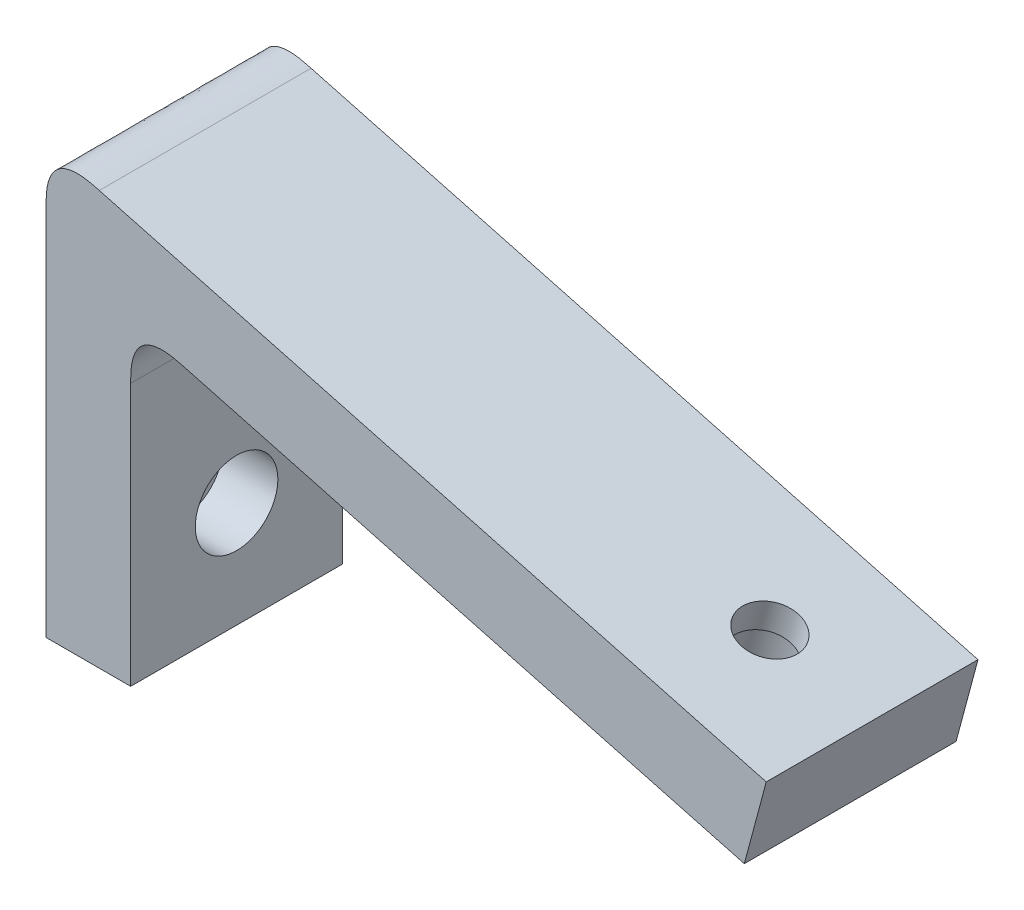
ISO-10303-21;
HEADER;
FILE_DESCRIPTION(('STEP AP214'),'2;1');
FILE_NAME('part.step','',(''),(''),'','','');
FILE_SCHEMA(('AUTOMOTIVE_DESIGN { 1 0 10303 214 1 1 1 1 }'));
ENDSEC;
DATA;
#1=APPLICATION_CONTEXT('core data for automotive mechanical design processes');
#2=APPLICATION_PROTOCOL_DEFINITION('international standard','automotive_design',2000,#1);
#3=PRODUCT_CONTEXT('',#1,'mechanical');
#4=PRODUCT('Part','Part','',(#3));
#5=PRODUCT_RELATED_PRODUCT_CATEGORY('part','',(#4));
#6=PRODUCT_DEFINITION_FORMATION('','',#4);
#7=PRODUCT_DEFINITION_CONTEXT('part definition',#1,'design');
#8=PRODUCT_DEFINITION('design','',#6,#7);
#9=PRODUCT_DEFINITION_SHAPE('','',#8);
#10=(LENGTH_UNIT() NAMED_UNIT(*) SI_UNIT(.MILLI.,.METRE.));
#11=(NAMED_UNIT(*) PLANE_ANGLE_UNIT() SI_UNIT($,.RADIAN.));
#12=(NAMED_UNIT(*) SI_UNIT($,.STERADIAN.) SOLID_ANGLE_UNIT());
#13=UNCERTAINTY_MEASURE_WITH_UNIT(LENGTH_MEASURE(1.E-05),#10,'distance_accuracy_value','');
#14=(GEOMETRIC_REPRESENTATION_CONTEXT(3) GLOBAL_UNCERTAINTY_ASSIGNED_CONTEXT((#13)) GLOBAL_UNIT_ASSIGNED_CONTEXT((#10,
#11,#12)) REPRESENTATION_CONTEXT('',''));
#15=CARTESIAN_POINT('',(0.,0.,0.));
#16=DIRECTION('',(0.,0.,1.));
#17=DIRECTION('',(1.,0.,0.));
#18=AXIS2_PLACEMENT_3D('',#15,#16,#17);
#19=CARTESIAN_POINT('',(0.,12.7,12.7));
#20=DIRECTION('',(-1.,0.,0.));
#21=DIRECTION('',(0.,0.,1.));
#22=AXIS2_PLACEMENT_3D('',#19,#20,#21);
#23=CYLINDRICAL_SURFACE('',#22,3.37819999999999);
#24=CARTESIAN_POINT('',(0.,12.7,12.7));
#25=DIRECTION('',(-1.,0.,0.));
#26=DIRECTION('',(0.,0.,1.));
#27=AXIS2_PLACEMENT_3D('',#24,#25,#26);
#28=CIRCLE('',#27,3.37819999999999);
#29=CARTESIAN_POINT('',(0.,12.7,16.0782));
#30=VERTEX_POINT('',#29);
#31=EDGE_CURVE('E140',#30,#30,#28,.T.);
#32=ORIENTED_EDGE('',*,*,#31,.T.);
#33=EDGE_LOOP('',(#32));
#34=FACE_BOUND('',#33,.T.);
#35=CARTESIAN_POINT('',(3.556,12.7,12.7));
#36=DIRECTION('',(1.,0.,0.));
#37=DIRECTION('',(0.,1.,0.));
#38=AXIS2_PLACEMENT_3D('',#35,#36,#37);
#39=CIRCLE('',#38,3.37819999999999);
#40=CARTESIAN_POINT('',(3.556,16.0782,12.7));
#41=VERTEX_POINT('',#40);
#42=EDGE_CURVE('E49',#41,#41,#39,.F.);
#43=ORIENTED_EDGE('',*,*,#42,.F.);
#44=EDGE_LOOP('',(#43));
#45=FACE_BOUND('',#44,.T.);
#46=ADVANCED_FACE('F41',(#34,#45),#23,.F.);
#47=CARTESIAN_POINT('',(74.1258914675974,31.4787970310866,12.7));
#48=DIRECTION('',(0.258819045102524,0.965925826289067,0.));
#49=DIRECTION('',(-0.965925826289068,0.258819045102524,0.));
#50=AXIS2_PLACEMENT_3D('',#47,#48,#49);
#51=CYLINDRICAL_SURFACE('',#50,3.37819999999999);
#52=CARTESIAN_POINT('',(74.1258914675974,31.4787970310866,12.7));
#53=DIRECTION('',(0.258819045102524,0.965925826289067,0.));
#54=DIRECTION('',(-0.965925826289068,0.258819045102524,0.));
#55=AXIS2_PLACEMENT_3D('',#52,#53,#54);
#56=CIRCLE('',#55,3.37819999999999);
#57=CARTESIAN_POINT('',(70.8628008412277,32.353139529252,12.7));
#58=VERTEX_POINT('',#57);
#59=EDGE_CURVE('E283',#58,#58,#56,.T.);
#60=ORIENTED_EDGE('',*,*,#59,.T.);
#61=EDGE_LOOP('',(#60));
#62=FACE_BOUND('',#61,.T.);
#63=CARTESIAN_POINT('',(73.2055309432129,28.0439647928027,12.7));
#64=DIRECTION('',(-0.258819045102525,-0.965925826289067,0.));
#65=DIRECTION('',(0.965925826289067,-0.258819045102525,0.));
#66=AXIS2_PLACEMENT_3D('',#63,#64,#65);
#67=CIRCLE('',#66,3.37819999999999);
#68=CARTESIAN_POINT('',(76.4686215695826,27.1696222946374,12.7));
#69=VERTEX_POINT('',#68);
#70=EDGE_CURVE('E276',#69,#69,#67,.F.);
#71=ORIENTED_EDGE('',*,*,#70,.F.);
#72=EDGE_LOOP('',(#71));
#73=FACE_BOUND('',#72,.T.);
#74=ADVANCED_FACE('F309',(#62,#73),#51,.F.);
#75=CARTESIAN_POINT('',(10.2055909487752,38.0877839420935,25.4));
#76=DIRECTION('',(-0.258819045102525,-0.965925826289067,0.));
#77=DIRECTION('',(0.965925826289067,-0.258819045102525,0.));
#78=AXIS2_PLACEMENT_3D('',#75,#76,#77);
#79=PLANE('',#78);
#80=CARTESIAN_POINT('',(71.4962899693558,21.6649906359897,12.7));
#81=DIRECTION('',(-0.258819045102525,-0.965925826289067,0.));
#82=DIRECTION('',(0.965925826289067,-0.258819045102525,0.));
#83=AXIS2_PLACEMENT_3D('',#80,#81,#82);
#84=CIRCLE('',#83,4.953);
#85=CARTESIAN_POINT('',(76.2805205869655,20.3830599055969,12.7));
#86=VERTEX_POINT('',#85);
#87=EDGE_CURVE('E289',#86,#86,#84,.T.);
#88=ORIENTED_EDGE('',*,*,#87,.F.);
#89=EDGE_LOOP('',(#88));
#90=FACE_BOUND('',#89,.T.);
#91=DIRECTION('',(-0.965925826289067,0.258819045102525,0.));
#92=VECTOR('',#91,1.);
#93=CARTESIAN_POINT('',(10.2055909487752,38.0877839420935,25.4));
#94=LINE('',#93,#92);
#95=CARTESIAN_POINT('',(83.7635479632269,18.3779887631876,25.4));
#96=VERTEX_POINT('',#95);
#97=CARTESIAN_POINT('',(16.5548007491208,36.3865183035151,25.4));
#98=VERTEX_POINT('',#97);
#99=EDGE_CURVE('E117',#96,#98,#94,.T.);
#100=ORIENTED_EDGE('',*,*,#99,.T.);
#101=CARTESIAN_POINT('',(16.5548007491208,36.3865183035151,-1.27));
#102=CARTESIAN_POINT('',(16.5548007491208,36.3865183035151,8.04333333333333));
#103=CARTESIAN_POINT('',(16.5548007491208,36.3865183035151,17.3566666666566));
#104=CARTESIAN_POINT('',(16.5548007491208,36.3865183035151,26.67));
#105=B_SPLINE_CURVE_WITH_KNOTS('',3,(#101,#102,#103,#104),.UNSPECIFIED.,.F.,.F.,(4,4),(-0.02667,
0.00127),.UNSPECIFIED.);
#106=CARTESIAN_POINT('',(16.5548007491208,36.3865183035151,0.));
#107=VERTEX_POINT('',#106);
#108=EDGE_CURVE('E255',#98,#107,#105,.F.);
#109=ORIENTED_EDGE('',*,*,#108,.T.);
#110=DIRECTION('',(-0.965925826289067,0.258819045102525,0.));
#111=VECTOR('',#110,1.);
#112=CARTESIAN_POINT('',(10.2055909487752,38.0877839420935,0.));
#113=LINE('',#112,#111);
#114=CARTESIAN_POINT('',(83.7635479632269,18.3779887631876,0.));
#115=VERTEX_POINT('',#114);
#116=EDGE_CURVE('E325',#115,#107,#113,.T.);
#117=ORIENTED_EDGE('',*,*,#116,.F.);
#118=DIRECTION('',(0.,0.,-1.));
#119=VECTOR('',#118,1.);
#120=CARTESIAN_POINT('',(83.7635479632269,18.3779887631876,25.4));
#121=LINE('',#120,#119);
#122=EDGE_CURVE('E127',#96,#115,#121,.T.);
#123=ORIENTED_EDGE('',*,*,#122,.F.);
#124=EDGE_LOOP('',(#100,#109,#117,#123));
#125=FACE_BOUND('',#124,.T.);
#126=ADVANCED_FACE('F316',(#90,#125),#79,.T.);
#127=CARTESIAN_POINT('',(0.,0.,25.4));
#128=DIRECTION('',(0.,-1.,0.));
#129=DIRECTION('',(1.,0.,0.));
#130=AXIS2_PLACEMENT_3D('',#127,#128,#129);
#131=PLANE('',#130);
#132=DIRECTION('',(-1.,0.,0.));
#133=VECTOR('',#132,1.);
#134=CARTESIAN_POINT('',(0.,0.,0.));
#135=LINE('',#134,#133);
#136=CARTESIAN_POINT('',(10.16,0.,0.));
#137=VERTEX_POINT('',#136);
#138=CARTESIAN_POINT('',(0.,0.,0.));
#139=VERTEX_POINT('',#138);
#140=EDGE_CURVE('E125',#137,#139,#135,.T.);
#141=ORIENTED_EDGE('',*,*,#140,.F.);
#142=DIRECTION('',(0.,0.,-1.));
#143=VECTOR('',#142,1.);
#144=CARTESIAN_POINT('',(10.16,0.,25.4));
#145=LINE('',#144,#143);
#146=CARTESIAN_POINT('',(10.16,0.,25.4));
#147=VERTEX_POINT('',#146);
#148=EDGE_CURVE('E114',#147,#137,#145,.T.);
#149=ORIENTED_EDGE('',*,*,#148,.F.);
#150=DIRECTION('',(-1.,0.,0.));
#151=VECTOR('',#150,1.);
#152=CARTESIAN_POINT('',(0.,0.,25.4));
#153=LINE('',#152,#151);
#154=CARTESIAN_POINT('',(0.,0.,25.4));
#155=VERTEX_POINT('',#154);
#156=EDGE_CURVE('E118',#147,#155,#153,.T.);
#157=ORIENTED_EDGE('',*,*,#156,.T.);
#158=DIRECTION('',(0.,0.,-1.));
#159=VECTOR('',#158,1.);
#160=CARTESIAN_POINT('',(0.,0.,25.4));
#161=LINE('',#160,#159);
#162=EDGE_CURVE('E363',#155,#139,#161,.T.);
#163=ORIENTED_EDGE('',*,*,#162,.T.);
#164=EDGE_LOOP('',(#141,#149,#157,#163));
#165=FACE_BOUND('',#164,.T.);
#166=ADVANCED_FACE('F122',(#165),#131,.T.);
#167=CARTESIAN_POINT('',(10.16,0.,25.4));
#168=DIRECTION('',(1.,0.,0.));
#169=DIRECTION('',(0.,1.,0.));
#170=AXIS2_PLACEMENT_3D('',#167,#168,#169);
#171=PLANE('',#170);
#172=CARTESIAN_POINT('',(10.16,12.7,12.7));
#173=DIRECTION('',(1.,0.,0.));
#174=DIRECTION('',(0.,1.,0.));
#175=AXIS2_PLACEMENT_3D('',#172,#173,#174);
#176=CIRCLE('',#175,4.953);
#177=CARTESIAN_POINT('',(10.16,17.653,12.7));
#178=VERTEX_POINT('',#177);
#179=EDGE_CURVE('E296',#178,#178,#176,.T.);
#180=ORIENTED_EDGE('',*,*,#179,.F.);
#181=EDGE_LOOP('',(#180));
#182=FACE_BOUND('',#181,.T.);
#183=DIRECTION('',(0.,-1.,0.));
#184=VECTOR('',#183,1.);
#185=CARTESIAN_POINT('',(10.16,0.,0.));
#186=LINE('',#185,#184);
#187=CARTESIAN_POINT('',(10.16,31.4796151059667,0.));
#188=VERTEX_POINT('',#187);
#189=EDGE_CURVE('E321',#188,#137,#186,.T.);
#190=ORIENTED_EDGE('',*,*,#189,.F.);
#191=CARTESIAN_POINT('',(10.16,31.4796151059667,26.67));
#192=CARTESIAN_POINT('',(10.16,31.4796151059667,17.3566666666566));
#193=CARTESIAN_POINT('',(10.16,31.4796151059667,8.04333333333333));
#194=CARTESIAN_POINT('',(10.16,31.4796151059667,-1.27));
#195=B_SPLINE_CURVE_WITH_KNOTS('',3,(#191,#192,#193,#194),.UNSPECIFIED.,.F.,.F.,(4,4),(-0.02667,
0.00127),.UNSPECIFIED.);
#196=CARTESIAN_POINT('',(10.16,31.4796151059667,25.4));
#197=VERTEX_POINT('',#196);
#198=EDGE_CURVE('E68',#188,#197,#195,.F.);
#199=ORIENTED_EDGE('',*,*,#198,.T.);
#200=DIRECTION('',(0.,-1.,0.));
#201=VECTOR('',#200,1.);
#202=CARTESIAN_POINT('',(10.16,0.,25.4));
#203=LINE('',#202,#201);
#204=EDGE_CURVE('E111',#197,#147,#203,.T.);
#205=ORIENTED_EDGE('',*,*,#204,.T.);
#206=ORIENTED_EDGE('',*,*,#148,.T.);
#207=EDGE_LOOP('',(#190,#199,#205,#206));
#208=FACE_BOUND('',#207,.T.);
#209=ADVANCED_FACE('F113',(#182,#208),#171,.T.);
#210=CARTESIAN_POINT('',(73.5579570144518,-19.7097951789058,25.4));
#211=DIRECTION('',(0.965925826289068,-0.258819045102523,0.));
#212=DIRECTION('',(0.258819045102523,0.965925826289068,0.));
#213=AXIS2_PLACEMENT_3D('',#210,#211,#212);
#214=PLANE('',#213);
#215=DIRECTION('',(-0.258819045102523,-0.965925826289068,0.));
#216=VECTOR('',#215,1.);
#217=CARTESIAN_POINT('',(73.5579570144518,-19.7097951789058,0.));
#218=LINE('',#217,#216);
#219=CARTESIAN_POINT('',(86.3931494614686,28.1917951582846,0.));
#220=VERTEX_POINT('',#219);
#221=EDGE_CURVE('E419',#220,#115,#218,.T.);
#222=ORIENTED_EDGE('',*,*,#221,.F.);
#223=DIRECTION('',(0.,0.,-1.));
#224=VECTOR('',#223,1.);
#225=CARTESIAN_POINT('',(86.3931494614686,28.1917951582846,25.4));
#226=LINE('',#225,#224);
#227=CARTESIAN_POINT('',(86.3931494614686,28.1917951582846,25.4));
#228=VERTEX_POINT('',#227);
#229=EDGE_CURVE('E358',#228,#220,#226,.T.);
#230=ORIENTED_EDGE('',*,*,#229,.F.);
#231=DIRECTION('',(-0.258819045102523,-0.965925826289068,0.));
#232=VECTOR('',#231,1.);
#233=CARTESIAN_POINT('',(73.5579570144518,-19.7097951789058,25.4));
#234=LINE('',#233,#232);
#235=EDGE_CURVE('E153',#228,#96,#234,.T.);
#236=ORIENTED_EDGE('',*,*,#235,.T.);
#237=ORIENTED_EDGE('',*,*,#122,.T.);
#238=EDGE_LOOP('',(#222,#230,#236,#237));
#239=FACE_BOUND('',#238,.T.);
#240=ADVANCED_FACE('F355',(#239),#214,.T.);
#241=CARTESIAN_POINT('',(12.8351924470168,47.9015903371904,25.4));
#242=DIRECTION('',(0.258819045102524,0.965925826289067,0.));
#243=DIRECTION('',(-0.965925826289067,0.258819045102524,0.));
#244=AXIS2_PLACEMENT_3D('',#241,#242,#243);
#245=PLANE('',#244);
#246=ORIENTED_EDGE('',*,*,#59,.F.);
#247=EDGE_LOOP('',(#246));
#248=FACE_BOUND('',#247,.T.);
#249=DIRECTION('',(0.965925826289067,-0.258819045102524,0.));
#250=VECTOR('',#249,1.);
#251=CARTESIAN_POINT('',(12.8351924470168,47.9015903371904,0.));
#252=LINE('',#251,#250);
#253=CARTESIAN_POINT('',(6.39480074912082,49.6272880915818,0.));
#254=VERTEX_POINT('',#253);
#255=EDGE_CURVE('E136',#254,#220,#252,.T.);
#256=ORIENTED_EDGE('',*,*,#255,.F.);
#257=CARTESIAN_POINT('',(6.39480074912082,49.6272880915818,26.67));
#258=CARTESIAN_POINT('',(6.39480074912082,49.6272880915818,17.3566666666404));
#259=CARTESIAN_POINT('',(6.39480074912082,49.6272880915818,8.04333333333333));
#260=CARTESIAN_POINT('',(6.39480074912082,49.6272880915818,-1.27));
#261=B_SPLINE_CURVE_WITH_KNOTS('',3,(#257,#258,#259,#260),.UNSPECIFIED.,.F.,.F.,(4,4),(-0.00127,
0.02667),.UNSPECIFIED.);
#262=CARTESIAN_POINT('',(6.39480074912082,49.6272880915818,25.4));
#263=VERTEX_POINT('',#262);
#264=EDGE_CURVE('E234',#254,#263,#261,.F.);
#265=ORIENTED_EDGE('',*,*,#264,.T.);
#266=DIRECTION('',(0.965925826289067,-0.258819045102524,0.));
#267=VECTOR('',#266,1.);
#268=CARTESIAN_POINT('',(12.8351924470168,47.9015903371904,25.4));
#269=LINE('',#268,#267);
#270=EDGE_CURVE('E343',#263,#228,#269,.T.);
#271=ORIENTED_EDGE('',*,*,#270,.T.);
#272=ORIENTED_EDGE('',*,*,#229,.T.);
#273=EDGE_LOOP('',(#256,#265,#271,#272));
#274=FACE_BOUND('',#273,.T.);
#275=ADVANCED_FACE('F405',(#248,#274),#245,.T.);
#276=CARTESIAN_POINT('',(0.,0.,25.4));
#277=DIRECTION('',(-1.,0.,0.));
#278=DIRECTION('',(0.,-1.,0.));
#279=AXIS2_PLACEMENT_3D('',#276,#277,#278);
#280=PLANE('',#279);
#281=ORIENTED_EDGE('',*,*,#31,.F.);
#282=EDGE_LOOP('',(#281));
#283=FACE_BOUND('',#282,.T.);
#284=DIRECTION('',(0.,1.,0.));
#285=VECTOR('',#284,1.);
#286=CARTESIAN_POINT('',(0.,0.,25.4));
#287=LINE('',#286,#285);
#288=CARTESIAN_POINT('',(0.,44.7203848940333,25.4));
#289=VERTEX_POINT('',#288);
#290=EDGE_CURVE('E132',#155,#289,#287,.T.);
#291=ORIENTED_EDGE('',*,*,#290,.T.);
#292=CARTESIAN_POINT('',(0.,44.7203848940333,-1.27));
#293=CARTESIAN_POINT('',(0.,44.7203848940333,8.04333333333333));
#294=CARTESIAN_POINT('',(0.,44.7203848940333,17.3566666666404));
#295=CARTESIAN_POINT('',(0.,44.7203848940333,26.67));
#296=B_SPLINE_CURVE_WITH_KNOTS('',3,(#292,#293,#294,#295),.UNSPECIFIED.,.F.,.F.,(4,4),(-0.00127,
0.02667),.UNSPECIFIED.);
#297=CARTESIAN_POINT('',(0.,44.7203848940333,0.));
#298=VERTEX_POINT('',#297);
#299=EDGE_CURVE('E126',#289,#298,#296,.F.);
#300=ORIENTED_EDGE('',*,*,#299,.T.);
#301=DIRECTION('',(0.,1.,0.));
#302=VECTOR('',#301,1.);
#303=CARTESIAN_POINT('',(0.,0.,0.));
#304=LINE('',#303,#302);
#305=EDGE_CURVE('E133',#139,#298,#304,.T.);
#306=ORIENTED_EDGE('',*,*,#305,.F.);
#307=ORIENTED_EDGE('',*,*,#162,.F.);
#308=EDGE_LOOP('',(#291,#300,#306,#307));
#309=FACE_BOUND('',#308,.T.);
#310=ADVANCED_FACE('F173',(#283,#309),#280,.T.);
#311=CARTESIAN_POINT('',(0.,0.,25.4));
#312=DIRECTION('',(0.,0.,1.));
#313=DIRECTION('',(1.,0.,0.));
#314=AXIS2_PLACEMENT_3D('',#311,#312,#313);
#315=PLANE('',#314);
#316=ORIENTED_EDGE('',*,*,#270,.F.);
#317=CARTESIAN_POINT('',(0.,44.7203848940333,25.4));
#318=CARTESIAN_POINT('',(0.,45.7805789830396,25.4));
#319=CARTESIAN_POINT('',(0.,46.8407730720459,25.4));
#320=CARTESIAN_POINT('',(0.538604258562221,49.1388481470478,25.4));
#321=CARTESIAN_POINT('',(1.98749194063571,50.2506187680531,25.4));
#322=CARTESIAN_POINT('',(4.34666304622046,50.1760849350617,25.4));
#323=CARTESIAN_POINT('',(5.37073189767064,49.9016865133217,25.4));
#324=CARTESIAN_POINT('',(6.39480074912082,49.6272880915818,25.4));
#325=B_SPLINE_CURVE_WITH_KNOTS('',5,(#317,#318,#319,#320,#321,#322,#323,#324),.UNSPECIFIED.,.F.,
.F.,(6,2,6),(0.,0.5,1.),.UNSPECIFIED.);
#326=EDGE_CURVE('E156',#263,#289,#325,.F.);
#327=ORIENTED_EDGE('',*,*,#326,.T.);
#328=ORIENTED_EDGE('',*,*,#290,.F.);
#329=ORIENTED_EDGE('',*,*,#156,.F.);
#330=ORIENTED_EDGE('',*,*,#204,.F.);
#331=CARTESIAN_POINT('',(16.5548007491208,36.3865183035151,25.4));
#332=CARTESIAN_POINT('',(15.5307318976706,36.6609167252551,25.4));
#333=CARTESIAN_POINT('',(14.5066630462205,36.935315146995,25.4));
#334=CARTESIAN_POINT('',(12.1474919406357,37.0098489799864,25.4));
#335=CARTESIAN_POINT('',(10.6986042585622,35.8980783589811,25.4));
#336=CARTESIAN_POINT('',(10.16,33.6000032839792,25.4));
#337=CARTESIAN_POINT('',(10.16,32.5398091949729,25.4));
#338=CARTESIAN_POINT('',(10.16,31.4796151059667,25.4));
#339=B_SPLINE_CURVE_WITH_KNOTS('',5,(#331,#332,#333,#334,#335,#336,#337,#338),.UNSPECIFIED.,.F.,
.F.,(6,2,6),(0.,0.5,1.),.UNSPECIFIED.);
#340=EDGE_CURVE('E11',#197,#98,#339,.F.);
#341=ORIENTED_EDGE('',*,*,#340,.T.);
#342=ORIENTED_EDGE('',*,*,#99,.F.);
#343=ORIENTED_EDGE('',*,*,#235,.F.);
#344=EDGE_LOOP('',(#316,#327,#328,#329,#330,#341,#342,#343));
#345=FACE_BOUND('',#344,.T.);
#346=ADVANCED_FACE('F130',(#345),#315,.T.);
#347=CARTESIAN_POINT('',(0.,0.,0.));
#348=DIRECTION('',(0.,0.,1.));
#349=DIRECTION('',(1.,0.,0.));
#350=AXIS2_PLACEMENT_3D('',#347,#348,#349);
#351=PLANE('',#350);
#352=ORIENTED_EDGE('',*,*,#305,.T.);
#353=CARTESIAN_POINT('',(6.39480074912082,49.6272880915818,0.));
#354=CARTESIAN_POINT('',(5.37073189767064,49.9016865133217,0.));
#355=CARTESIAN_POINT('',(4.34666304622046,50.1760849350617,0.));
#356=CARTESIAN_POINT('',(1.98749194063571,50.2506187680531,0.));
#357=CARTESIAN_POINT('',(0.538604258562221,49.1388481470478,0.));
#358=CARTESIAN_POINT('',(0.,46.8407730720459,0.));
#359=CARTESIAN_POINT('',(0.,45.7805789830396,0.));
#360=CARTESIAN_POINT('',(0.,44.7203848940333,0.));
#361=B_SPLINE_CURVE_WITH_KNOTS('',5,(#353,#354,#355,#356,#357,#358,#359,#360),.UNSPECIFIED.,.F.,
.F.,(6,2,6),(0.,0.5,1.),.UNSPECIFIED.);
#362=EDGE_CURVE('E192',#298,#254,#361,.F.);
#363=ORIENTED_EDGE('',*,*,#362,.T.);
#364=ORIENTED_EDGE('',*,*,#255,.T.);
#365=ORIENTED_EDGE('',*,*,#221,.T.);
#366=ORIENTED_EDGE('',*,*,#116,.T.);
#367=CARTESIAN_POINT('',(10.16,31.4796151059667,0.));
#368=CARTESIAN_POINT('',(10.16,32.5398091949729,0.));
#369=CARTESIAN_POINT('',(10.16,33.6000032839792,0.));
#370=CARTESIAN_POINT('',(10.6986042585622,35.8980783589811,0.));
#371=CARTESIAN_POINT('',(12.1474919406357,37.0098489799864,0.));
#372=CARTESIAN_POINT('',(14.5066630462205,36.935315146995,0.));
#373=CARTESIAN_POINT('',(15.5307318976706,36.660916725255,0.));
#374=CARTESIAN_POINT('',(16.5548007491208,36.3865183035151,0.));
#375=B_SPLINE_CURVE_WITH_KNOTS('',5,(#367,#368,#369,#370,#371,#372,#373,#374),.UNSPECIFIED.,.F.,
.F.,(6,2,6),(0.,0.5,1.),.UNSPECIFIED.);
#376=EDGE_CURVE('E54',#107,#188,#375,.F.);
#377=ORIENTED_EDGE('',*,*,#376,.T.);
#378=ORIENTED_EDGE('',*,*,#189,.T.);
#379=ORIENTED_EDGE('',*,*,#140,.T.);
#380=EDGE_LOOP('',(#352,#363,#364,#365,#366,#377,#378,#379));
#381=FACE_BOUND('',#380,.T.);
#382=ADVANCED_FACE('F172',(#381),#351,.F.);
#383=CARTESIAN_POINT('',(0.,44.7203848940333,26.67));
#384=CARTESIAN_POINT('',(0.,44.7203848940333,17.3566666666404));
#385=CARTESIAN_POINT('',(0.,44.7203848940333,8.04333333333333));
#386=CARTESIAN_POINT('',(0.,44.7203848940333,-1.27));
#387=CARTESIAN_POINT('',(0.,45.7805789830396,26.67));
#388=CARTESIAN_POINT('',(0.,45.7805789830396,17.3566666666404));
#389=CARTESIAN_POINT('',(0.,45.7805789830396,8.04333333333333));
#390=CARTESIAN_POINT('',(0.,45.7805789830396,-1.27));
#391=CARTESIAN_POINT('',(0.,46.8407730720459,26.67));
#392=CARTESIAN_POINT('',(0.,46.8407730720459,17.3566666666404));
#393=CARTESIAN_POINT('',(0.,46.8407730720459,8.04333333333333));
#394=CARTESIAN_POINT('',(0.,46.8407730720459,-1.27));
#395=CARTESIAN_POINT('',(0.538604258562221,49.1388481470478,26.67));
#396=CARTESIAN_POINT('',(0.538604258562221,49.1388481470478,17.3566666666404));
#397=CARTESIAN_POINT('',(0.538604258562221,49.1388481470478,8.04333333333333));
#398=CARTESIAN_POINT('',(0.538604258562221,49.1388481470478,-1.27));
#399=CARTESIAN_POINT('',(1.98749194063571,50.2506187680531,26.67));
#400=CARTESIAN_POINT('',(1.98749194063571,50.2506187680531,17.3566666666404));
#401=CARTESIAN_POINT('',(1.98749194063571,50.2506187680531,8.04333333333333));
#402=CARTESIAN_POINT('',(1.98749194063571,50.2506187680531,-1.27));
#403=CARTESIAN_POINT('',(4.34666304622046,50.1760849350617,26.67));
#404=CARTESIAN_POINT('',(4.34666304622046,50.1760849350617,17.3566666666404));
#405=CARTESIAN_POINT('',(4.34666304622046,50.1760849350617,8.04333333333333));
#406=CARTESIAN_POINT('',(4.34666304622046,50.1760849350617,-1.27));
#407=CARTESIAN_POINT('',(5.37073189767064,49.9016865133217,26.67));
#408=CARTESIAN_POINT('',(5.37073189767064,49.9016865133217,17.3566666666404));
#409=CARTESIAN_POINT('',(5.37073189767064,49.9016865133217,8.04333333333333));
#410=CARTESIAN_POINT('',(5.37073189767064,49.9016865133217,-1.27));
#411=CARTESIAN_POINT('',(6.39480074912082,49.6272880915818,26.67));
#412=CARTESIAN_POINT('',(6.39480074912082,49.6272880915818,17.3566666666404));
#413=CARTESIAN_POINT('',(6.39480074912082,49.6272880915818,8.04333333333333));
#414=CARTESIAN_POINT('',(6.39480074912082,49.6272880915818,-1.27));
#415=B_SPLINE_SURFACE_WITH_KNOTS('',5,3,((#383,#384,#385,#386),(#387,#388,#389,#390),(#391,#392,
#393,#394),(#395,#396,#397,#398),(#399,#400,#401,#402),(#403,#404,#405,#406),(#407,#408,#409,
#410),(#411,#412,#413,#414)),.UNSPECIFIED.,.F.,.F.,.F.,(6,2,6),(4,4),(0.,0.5,1.),(-0.00127,
0.02667),.UNSPECIFIED.);
#416=ORIENTED_EDGE('',*,*,#326,.F.);
#417=ORIENTED_EDGE('',*,*,#264,.F.);
#418=ORIENTED_EDGE('',*,*,#362,.F.);
#419=ORIENTED_EDGE('',*,*,#299,.F.);
#420=EDGE_LOOP('',(#416,#417,#418,#419));
#421=FACE_BOUND('',#420,.T.);
#422=ADVANCED_FACE('F199',(#421),#415,.T.);
#423=CARTESIAN_POINT('',(10.16,31.4796151059667,-1.27));
#424=CARTESIAN_POINT('',(10.16,31.4796151059667,8.04333333333333));
#425=CARTESIAN_POINT('',(10.16,31.4796151059667,17.3566666666566));
#426=CARTESIAN_POINT('',(10.16,31.4796151059667,26.67));
#427=CARTESIAN_POINT('',(10.16,32.5398091949729,-1.27));
#428=CARTESIAN_POINT('',(10.16,32.5398091949729,8.04333333333333));
#429=CARTESIAN_POINT('',(10.16,32.5398091949729,17.3566666666566));
#430=CARTESIAN_POINT('',(10.16,32.5398091949729,26.67));
#431=CARTESIAN_POINT('',(10.16,33.6000032839792,-1.27));
#432=CARTESIAN_POINT('',(10.16,33.6000032839792,8.04333333333333));
#433=CARTESIAN_POINT('',(10.16,33.6000032839792,17.3566666666566));
#434=CARTESIAN_POINT('',(10.16,33.6000032839792,26.67));
#435=CARTESIAN_POINT('',(10.6986042585622,35.8980783589811,-1.27));
#436=CARTESIAN_POINT('',(10.6986042585622,35.8980783589811,8.04333333333333));
#437=CARTESIAN_POINT('',(10.6986042585622,35.8980783589811,17.3566666666566));
#438=CARTESIAN_POINT('',(10.6986042585622,35.8980783589811,26.67));
#439=CARTESIAN_POINT('',(12.1474919406357,37.0098489799864,-1.27));
#440=CARTESIAN_POINT('',(12.1474919406357,37.0098489799864,8.04333333333333));
#441=CARTESIAN_POINT('',(12.1474919406357,37.0098489799864,17.3566666666566));
#442=CARTESIAN_POINT('',(12.1474919406357,37.0098489799864,26.67));
#443=CARTESIAN_POINT('',(14.5066630462205,36.935315146995,-1.27));
#444=CARTESIAN_POINT('',(14.5066630462205,36.935315146995,8.04333333333333));
#445=CARTESIAN_POINT('',(14.5066630462205,36.935315146995,17.3566666666566));
#446=CARTESIAN_POINT('',(14.5066630462205,36.935315146995,26.67));
#447=CARTESIAN_POINT('',(15.5307318976706,36.6609167252551,-1.27));
#448=CARTESIAN_POINT('',(15.5307318976706,36.6609167252551,8.04333333333333));
#449=CARTESIAN_POINT('',(15.5307318976706,36.6609167252551,17.3566666666566));
#450=CARTESIAN_POINT('',(15.5307318976706,36.6609167252551,26.67));
#451=CARTESIAN_POINT('',(16.5548007491208,36.3865183035151,-1.27));
#452=CARTESIAN_POINT('',(16.5548007491208,36.3865183035151,8.04333333333333));
#453=CARTESIAN_POINT('',(16.5548007491208,36.3865183035151,17.3566666666566));
#454=CARTESIAN_POINT('',(16.5548007491208,36.3865183035151,26.67));
#455=B_SPLINE_SURFACE_WITH_KNOTS('',5,3,((#423,#424,#425,#426),(#427,#428,#429,#430),(#431,#432,
#433,#434),(#435,#436,#437,#438),(#439,#440,#441,#442),(#443,#444,#445,#446),(#447,#448,#449,
#450),(#451,#452,#453,#454)),.UNSPECIFIED.,.F.,.F.,.F.,(6,2,6),(4,4),(0.,0.5,1.),(-0.02667,
0.00127),.UNSPECIFIED.);
#456=ORIENTED_EDGE('',*,*,#340,.F.);
#457=ORIENTED_EDGE('',*,*,#198,.F.);
#458=ORIENTED_EDGE('',*,*,#376,.F.);
#459=ORIENTED_EDGE('',*,*,#108,.F.);
#460=EDGE_LOOP('',(#456,#457,#458,#459));
#461=FACE_BOUND('',#460,.T.);
#462=ADVANCED_FACE('F44',(#461),#455,.T.);
#463=CARTESIAN_POINT('',(73.2055309432129,28.0439647928027,12.7));
#464=DIRECTION('',(-0.258819045102525,-0.965925826289067,0.));
#465=DIRECTION('',(0.965925826289067,-0.258819045102525,0.));
#466=AXIS2_PLACEMENT_3D('',#463,#464,#465);
#467=PLANE('',#466);
#468=CARTESIAN_POINT('',(73.2055309432129,28.0439647928027,12.7));
#469=DIRECTION('',(-0.258819045102525,-0.965925826289067,0.));
#470=DIRECTION('',(0.965925826289067,-0.258819045102525,0.));
#471=AXIS2_PLACEMENT_3D('',#468,#469,#470);
#472=CIRCLE('',#471,4.953);
#473=CARTESIAN_POINT('',(77.9897615608226,26.7620340624099,12.7));
#474=VERTEX_POINT('',#473);
#475=EDGE_CURVE('E284',#474,#474,#472,.T.);
#476=ORIENTED_EDGE('',*,*,#475,.T.);
#477=EDGE_LOOP('',(#476));
#478=FACE_BOUND('',#477,.T.);
#479=ORIENTED_EDGE('',*,*,#70,.T.);
#480=EDGE_LOOP('',(#479));
#481=FACE_BOUND('',#480,.T.);
#482=ADVANCED_FACE('F447',(#478,#481),#467,.T.);
#483=CARTESIAN_POINT('',(73.2055309432129,28.0439647928027,12.7));
#484=DIRECTION('',(-0.258819045102525,-0.965925826289067,0.));
#485=DIRECTION('',(0.965925826289067,-0.258819045102525,0.));
#486=AXIS2_PLACEMENT_3D('',#483,#484,#485);
#487=CYLINDRICAL_SURFACE('',#486,4.953);
#488=ORIENTED_EDGE('',*,*,#475,.F.);
#489=EDGE_LOOP('',(#488));
#490=FACE_BOUND('',#489,.T.);
#491=ORIENTED_EDGE('',*,*,#87,.T.);
#492=EDGE_LOOP('',(#491));
#493=FACE_BOUND('',#492,.T.);
#494=ADVANCED_FACE('F462',(#490,#493),#487,.F.);
#495=CARTESIAN_POINT('',(3.556,12.7,12.7));
#496=DIRECTION('',(1.,0.,0.));
#497=DIRECTION('',(0.,1.,0.));
#498=AXIS2_PLACEMENT_3D('',#495,#496,#497);
#499=PLANE('',#498);
#500=CARTESIAN_POINT('',(3.556,12.7,12.7));
#501=DIRECTION('',(1.,0.,0.));
#502=DIRECTION('',(0.,1.,0.));
#503=AXIS2_PLACEMENT_3D('',#500,#501,#502);
#504=CIRCLE('',#503,4.953);
#505=CARTESIAN_POINT('',(3.556,17.653,12.7));
#506=VERTEX_POINT('',#505);
#507=EDGE_CURVE('E299',#506,#506,#504,.T.);
#508=ORIENTED_EDGE('',*,*,#507,.T.);
#509=EDGE_LOOP('',(#508));
#510=FACE_BOUND('',#509,.T.);
#511=ORIENTED_EDGE('',*,*,#42,.T.);
#512=EDGE_LOOP('',(#511));
#513=FACE_BOUND('',#512,.T.);
#514=ADVANCED_FACE('F306',(#510,#513),#499,.T.);
#515=CARTESIAN_POINT('',(3.556,12.7,12.7));
#516=DIRECTION('',(1.,0.,0.));
#517=DIRECTION('',(0.,1.,0.));
#518=AXIS2_PLACEMENT_3D('',#515,#516,#517);
#519=CYLINDRICAL_SURFACE('',#518,4.953);
#520=CARTESIAN_POINT('',(3.556,17.653,12.7));
#521=CARTESIAN_POINT('',(3.62479166666667,17.653,12.7));
#522=CARTESIAN_POINT('',(3.69358333333333,17.653,12.7));
#523=CARTESIAN_POINT('',(3.83116666666667,17.653,12.7));
#524=CARTESIAN_POINT('',(3.89995833333333,17.653,12.7));
#525=CARTESIAN_POINT('',(4.03754166666667,17.653,12.7));
#526=CARTESIAN_POINT('',(4.10633333333333,17.653,12.7));
#527=CARTESIAN_POINT('',(4.24391666666666,17.653,12.7));
#528=CARTESIAN_POINT('',(4.31270833333333,17.653,12.7));
#529=CARTESIAN_POINT('',(4.45029166666666,17.653,12.7));
#530=CARTESIAN_POINT('',(4.51908333333333,17.653,12.7));
#531=CARTESIAN_POINT('',(4.65666666666666,17.653,12.7));
#532=CARTESIAN_POINT('',(4.72545833333333,17.653,12.7));
#533=CARTESIAN_POINT('',(4.86304166666666,17.653,12.7));
#534=CARTESIAN_POINT('',(4.93183333333333,17.653,12.7));
#535=CARTESIAN_POINT('',(5.06941666666666,17.653,12.7));
#536=CARTESIAN_POINT('',(5.13820833333333,17.653,12.7));
#537=CARTESIAN_POINT('',(5.27579166666666,17.653,12.7));
#538=CARTESIAN_POINT('',(5.34458333333333,17.653,12.7));
#539=CARTESIAN_POINT('',(5.48216666666666,17.653,12.7));
#540=CARTESIAN_POINT('',(5.55095833333333,17.653,12.7));
#541=CARTESIAN_POINT('',(5.68854166666666,17.653,12.7));
#542=CARTESIAN_POINT('',(5.75733333333333,17.653,12.7));
#543=CARTESIAN_POINT('',(5.89491666666666,17.653,12.7));
#544=CARTESIAN_POINT('',(5.96370833333333,17.653,12.7));
#545=CARTESIAN_POINT('',(6.10129166666666,17.653,12.7));
#546=CARTESIAN_POINT('',(6.17008333333333,17.653,12.7));
#547=CARTESIAN_POINT('',(6.30766666666666,17.653,12.7));
#548=CARTESIAN_POINT('',(6.37645833333333,17.653,12.7));
#549=CARTESIAN_POINT('',(6.51404166666666,17.653,12.7));
#550=CARTESIAN_POINT('',(6.58283333333333,17.653,12.7));
#551=CARTESIAN_POINT('',(6.72041666666666,17.653,12.7));
#552=CARTESIAN_POINT('',(6.78920833333333,17.653,12.7));
#553=CARTESIAN_POINT('',(6.92679166666666,17.653,12.7));
#554=CARTESIAN_POINT('',(6.99558333333333,17.653,12.7));
#555=CARTESIAN_POINT('',(7.13316666666666,17.653,12.7));
#556=CARTESIAN_POINT('',(7.20195833333333,17.653,12.7));
#557=CARTESIAN_POINT('',(7.33954166666666,17.653,12.7));
#558=CARTESIAN_POINT('',(7.40833333333333,17.653,12.7));
#559=CARTESIAN_POINT('',(7.54591666666666,17.653,12.7));
#560=CARTESIAN_POINT('',(7.61470833333333,17.653,12.7));
#561=CARTESIAN_POINT('',(7.75229166666666,17.653,12.7));
#562=CARTESIAN_POINT('',(7.82108333333333,17.653,12.7));
#563=CARTESIAN_POINT('',(7.95866666666666,17.653,12.7));
#564=CARTESIAN_POINT('',(8.02745833333333,17.653,12.7));
#565=CARTESIAN_POINT('',(8.16504166666666,17.653,12.7));
#566=CARTESIAN_POINT('',(8.23383333333333,17.653,12.7));
#567=CARTESIAN_POINT('',(8.37141666666666,17.653,12.7));
#568=CARTESIAN_POINT('',(8.44020833333333,17.653,12.7));
#569=CARTESIAN_POINT('',(8.57779166666667,17.653,12.7));
#570=CARTESIAN_POINT('',(8.64658333333333,17.653,12.7));
#571=CARTESIAN_POINT('',(8.78416666666666,17.653,12.7));
#572=CARTESIAN_POINT('',(8.85295833333333,17.653,12.7));
#573=CARTESIAN_POINT('',(8.99054166666667,17.653,12.7));
#574=CARTESIAN_POINT('',(9.05933333333333,17.653,12.7));
#575=CARTESIAN_POINT('',(9.19691666666666,17.653,12.7));
#576=CARTESIAN_POINT('',(9.26570833333333,17.653,12.7));
#577=CARTESIAN_POINT('',(9.40329166666667,17.653,12.7));
#578=CARTESIAN_POINT('',(9.47208333333333,17.653,12.7));
#579=CARTESIAN_POINT('',(9.60966666666666,17.653,12.7));
#580=CARTESIAN_POINT('',(9.67845833333333,17.653,12.7));
#581=CARTESIAN_POINT('',(9.81604166666667,17.653,12.7));
#582=CARTESIAN_POINT('',(9.88483333333333,17.653,12.7));
#583=CARTESIAN_POINT('',(10.0224166666667,17.653,12.7));
#584=CARTESIAN_POINT('',(10.0912083333333,17.653,12.7));
#585=CARTESIAN_POINT('',(10.16,17.653,12.7));
#586=B_SPLINE_CURVE_WITH_KNOTS('',3,(#520,#521,#522,#523,#524,#525,#526,#527,#528,#529,#530,
#531,#532,#533,#534,#535,#536,#537,#538,#539,#540,#541,#542,#543,#544,#545,#546,#547,#548,#549,
#550,#551,#552,#553,#554,#555,#556,#557,#558,#559,#560,#561,#562,#563,#564,#565,#566,#567,#568,
#569,#570,#571,#572,#573,#574,#575,#576,#577,#578,#579,#580,#581,#582,#583,#584,#585),
.UNSPECIFIED.,.F.,.F.,(4,2,2,2,2,2,2,2,2,2,2,2,2,2,2,2,2,2,2,2,2,2,2,2,2,2,2,2,2,2,2,2,4),(0.,
0.206375,0.41275,0.619125,0.8255,1.031875,1.23825,1.444625,1.651,1.857375,2.06375,2.270125,
2.4765,2.682875,2.88925,3.095625,3.302,3.508375,3.71475,3.921125,4.1275,4.333875,4.54025,
4.746625,4.953,5.159375,5.36575,5.572125,5.7785,5.984875,6.19125,6.397625,6.604),.UNSPECIFIED.);
#587=EDGE_CURVE('BSEAM484',#506,#178,#586,.T.);
#588=ORIENTED_EDGE('',*,*,#507,.F.);
#589=ORIENTED_EDGE('',*,*,#179,.T.);
#590=ORIENTED_EDGE('',*,*,#587,.T.);
#591=ORIENTED_EDGE('',*,*,#587,.F.);
#592=EDGE_LOOP('',(#588,#590,#589,#591));
#593=FACE_BOUND('',#592,.T.);
#594=ADVANCED_FACE('F484',(#593),#519,.F.);
#595=CLOSED_SHELL('',(#46,#74,#126,#166,#209,#240,#275,#310,#346,#382,#422,#462,#482,#494,#514,#594));
#596=MANIFOLD_SOLID_BREP('B2',#595);
#597=ADVANCED_BREP_SHAPE_REPRESENTATION('',(#18,#596),#14);
#598=SHAPE_DEFINITION_REPRESENTATION(#9,#597);
ENDSEC;
END-ISO-10303-21;
